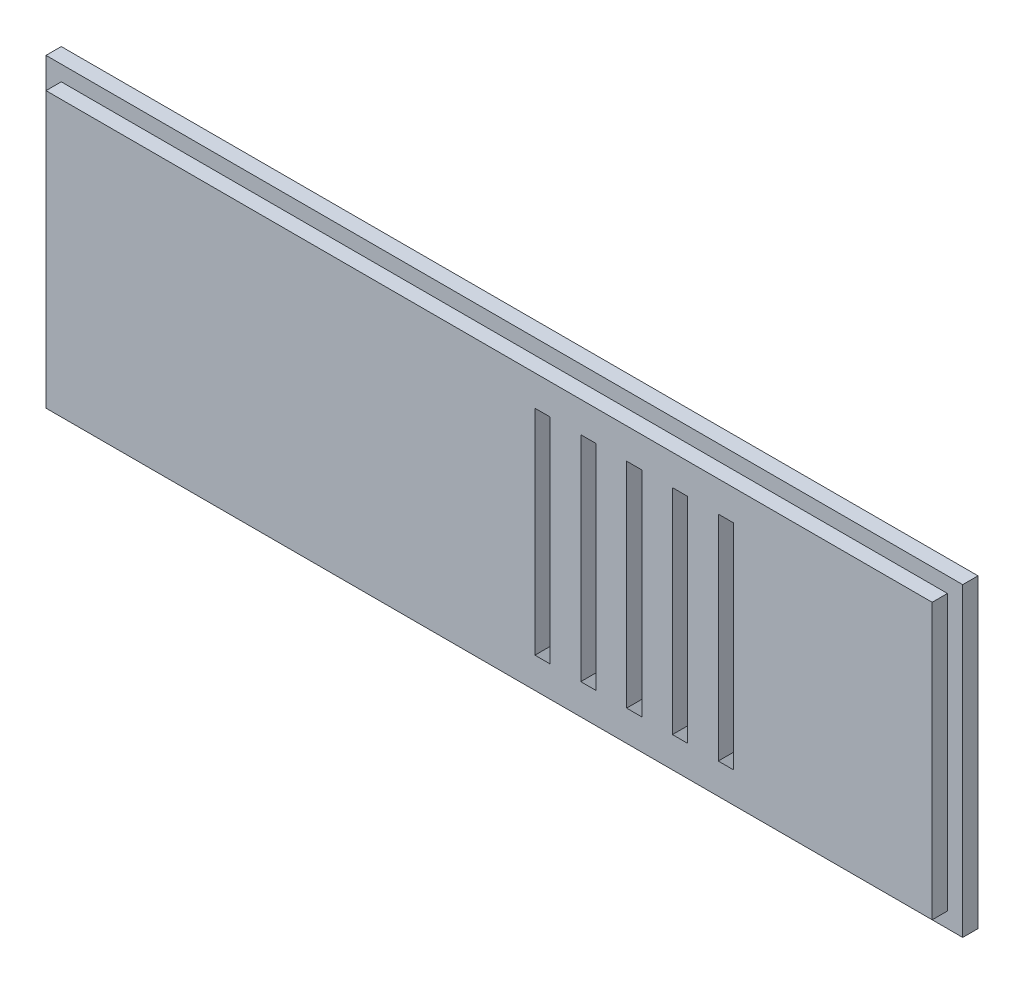
ISO-10303-21;
HEADER;
FILE_DESCRIPTION(('STEP AP214'),'2;1');
FILE_NAME('part.step','',(''),(''),'','','');
FILE_SCHEMA(('AUTOMOTIVE_DESIGN { 1 0 10303 214 1 1 1 1 }'));
ENDSEC;
DATA;
#1=APPLICATION_CONTEXT('core data for automotive mechanical design processes');
#2=APPLICATION_PROTOCOL_DEFINITION('international standard','automotive_design',2000,#1);
#3=PRODUCT_CONTEXT('',#1,'mechanical');
#4=PRODUCT('Part','Part','',(#3));
#5=PRODUCT_RELATED_PRODUCT_CATEGORY('part','',(#4));
#6=PRODUCT_DEFINITION_FORMATION('','',#4);
#7=PRODUCT_DEFINITION_CONTEXT('part definition',#1,'design');
#8=PRODUCT_DEFINITION('design','',#6,#7);
#9=PRODUCT_DEFINITION_SHAPE('','',#8);
#10=(LENGTH_UNIT() NAMED_UNIT(*) SI_UNIT(.MILLI.,.METRE.));
#11=(NAMED_UNIT(*) PLANE_ANGLE_UNIT() SI_UNIT($,.RADIAN.));
#12=(NAMED_UNIT(*) SI_UNIT($,.STERADIAN.) SOLID_ANGLE_UNIT());
#13=UNCERTAINTY_MEASURE_WITH_UNIT(LENGTH_MEASURE(1.E-05),#10,'distance_accuracy_value','');
#14=(GEOMETRIC_REPRESENTATION_CONTEXT(3) GLOBAL_UNCERTAINTY_ASSIGNED_CONTEXT((#13)) GLOBAL_UNIT_ASSIGNED_CONTEXT((#10,
#11,#12)) REPRESENTATION_CONTEXT('',''));
#15=CARTESIAN_POINT('',(0.,0.,0.));
#16=DIRECTION('',(0.,0.,1.));
#17=DIRECTION('',(1.,0.,0.));
#18=AXIS2_PLACEMENT_3D('',#15,#16,#17);
#19=CARTESIAN_POINT('',(0.,0.,1.));
#20=DIRECTION('',(0.,0.,-1.));
#21=DIRECTION('',(-1.,0.,0.));
#22=AXIS2_PLACEMENT_3D('',#19,#20,#21);
#23=PLANE('',#22);
#24=DIRECTION('',(0.,-1.,0.));
#25=VECTOR('',#24,1.);
#26=CARTESIAN_POINT('',(-30.,-10.,1.));
#27=LINE('',#26,#25);
#28=CARTESIAN_POINT('',(-30.,10.,1.));
#29=VERTEX_POINT('',#28);
#30=CARTESIAN_POINT('',(-30.,-10.,1.));
#31=VERTEX_POINT('',#30);
#32=EDGE_CURVE('E455',#29,#31,#27,.T.);
#33=ORIENTED_EDGE('',*,*,#32,.T.);
#34=DIRECTION('',(1.,0.,0.));
#35=VECTOR('',#34,1.);
#36=CARTESIAN_POINT('',(-30.,-10.,1.));
#37=LINE('',#36,#35);
#38=CARTESIAN_POINT('',(30.,-10.,1.));
#39=VERTEX_POINT('',#38);
#40=EDGE_CURVE('E459',#31,#39,#37,.T.);
#41=ORIENTED_EDGE('',*,*,#40,.T.);
#42=DIRECTION('',(0.,1.,0.));
#43=VECTOR('',#42,1.);
#44=CARTESIAN_POINT('',(30.,-10.,1.));
#45=LINE('',#44,#43);
#46=CARTESIAN_POINT('',(30.,10.,1.));
#47=VERTEX_POINT('',#46);
#48=EDGE_CURVE('E463',#39,#47,#45,.T.);
#49=ORIENTED_EDGE('',*,*,#48,.T.);
#50=DIRECTION('',(-1.,0.,0.));
#51=VECTOR('',#50,1.);
#52=CARTESIAN_POINT('',(-30.,10.,1.));
#53=LINE('',#52,#51);
#54=EDGE_CURVE('E466',#47,#29,#53,.T.);
#55=ORIENTED_EDGE('',*,*,#54,.T.);
#56=EDGE_LOOP('',(#33,#41,#49,#55));
#57=FACE_BOUND('',#56,.T.);
#58=DIRECTION('',(-1.,0.,0.));
#59=VECTOR('',#58,1.);
#60=CARTESIAN_POINT('',(29.,9.,1.));
#61=LINE('',#60,#59);
#62=CARTESIAN_POINT('',(29.,9.,1.));
#63=VERTEX_POINT('',#62);
#64=CARTESIAN_POINT('',(-29.,9.,1.));
#65=VERTEX_POINT('',#64);
#66=EDGE_CURVE('E412',#63,#65,#61,.T.);
#67=ORIENTED_EDGE('',*,*,#66,.F.);
#68=DIRECTION('',(0.,1.,0.));
#69=VECTOR('',#68,1.);
#70=CARTESIAN_POINT('',(29.,-9.,1.));
#71=LINE('',#70,#69);
#72=CARTESIAN_POINT('',(29.,-9.,1.));
#73=VERTEX_POINT('',#72);
#74=EDGE_CURVE('E434',#73,#63,#71,.T.);
#75=ORIENTED_EDGE('',*,*,#74,.F.);
#76=DIRECTION('',(1.,0.,0.));
#77=VECTOR('',#76,1.);
#78=CARTESIAN_POINT('',(-29.,-9.,1.));
#79=LINE('',#78,#77);
#80=CARTESIAN_POINT('',(-29.,-9.,1.));
#81=VERTEX_POINT('',#80);
#82=EDGE_CURVE('E425',#81,#73,#79,.T.);
#83=ORIENTED_EDGE('',*,*,#82,.F.);
#84=DIRECTION('',(0.,-1.,0.));
#85=VECTOR('',#84,1.);
#86=CARTESIAN_POINT('',(-29.,9.,1.));
#87=LINE('',#86,#85);
#88=EDGE_CURVE('E418',#65,#81,#87,.T.);
#89=ORIENTED_EDGE('',*,*,#88,.F.);
#90=EDGE_LOOP('',(#67,#75,#83,#89));
#91=FACE_BOUND('',#90,.T.);
#92=ADVANCED_FACE('F41',(#57,#91),#23,.F.);
#93=CARTESIAN_POINT('',(-30.,-10.,1.));
#94=DIRECTION('',(1.,0.,0.));
#95=DIRECTION('',(0.,0.,-1.));
#96=AXIS2_PLACEMENT_3D('',#93,#94,#95);
#97=PLANE('',#96);
#98=DIRECTION('',(0.,-1.,0.));
#99=VECTOR('',#98,1.);
#100=CARTESIAN_POINT('',(-30.,-10.,0.));
#101=LINE('',#100,#99);
#102=CARTESIAN_POINT('',(-30.,10.,0.));
#103=VERTEX_POINT('',#102);
#104=CARTESIAN_POINT('',(-30.,-10.,0.));
#105=VERTEX_POINT('',#104);
#106=EDGE_CURVE('E454',#103,#105,#101,.T.);
#107=ORIENTED_EDGE('',*,*,#106,.T.);
#108=DIRECTION('',(0.,0.,-1.));
#109=VECTOR('',#108,1.);
#110=CARTESIAN_POINT('',(-30.,-10.,1.));
#111=LINE('',#110,#109);
#112=EDGE_CURVE('E222',#31,#105,#111,.T.);
#113=ORIENTED_EDGE('',*,*,#112,.F.);
#114=ORIENTED_EDGE('',*,*,#32,.F.);
#115=DIRECTION('',(0.,0.,-1.));
#116=VECTOR('',#115,1.);
#117=CARTESIAN_POINT('',(-30.,10.,1.));
#118=LINE('',#117,#116);
#119=EDGE_CURVE('E469',#29,#103,#118,.T.);
#120=ORIENTED_EDGE('',*,*,#119,.T.);
#121=EDGE_LOOP('',(#107,#113,#114,#120));
#122=FACE_BOUND('',#121,.T.);
#123=ADVANCED_FACE('F546',(#122),#97,.F.);
#124=CARTESIAN_POINT('',(-30.,-10.,1.));
#125=DIRECTION('',(0.,1.,0.));
#126=DIRECTION('',(0.,0.,1.));
#127=AXIS2_PLACEMENT_3D('',#124,#125,#126);
#128=PLANE('',#127);
#129=DIRECTION('',(1.,0.,0.));
#130=VECTOR('',#129,1.);
#131=CARTESIAN_POINT('',(-30.,-10.,0.));
#132=LINE('',#131,#130);
#133=CARTESIAN_POINT('',(30.,-10.,0.));
#134=VERTEX_POINT('',#133);
#135=EDGE_CURVE('E473',#105,#134,#132,.T.);
#136=ORIENTED_EDGE('',*,*,#135,.T.);
#137=DIRECTION('',(0.,0.,-1.));
#138=VECTOR('',#137,1.);
#139=CARTESIAN_POINT('',(30.,-10.,1.));
#140=LINE('',#139,#138);
#141=EDGE_CURVE('E488',#39,#134,#140,.T.);
#142=ORIENTED_EDGE('',*,*,#141,.F.);
#143=ORIENTED_EDGE('',*,*,#40,.F.);
#144=ORIENTED_EDGE('',*,*,#112,.T.);
#145=EDGE_LOOP('',(#136,#142,#143,#144));
#146=FACE_BOUND('',#145,.T.);
#147=ADVANCED_FACE('F552',(#146),#128,.F.);
#148=CARTESIAN_POINT('',(30.,-10.,1.));
#149=DIRECTION('',(-1.,0.,0.));
#150=DIRECTION('',(0.,0.,1.));
#151=AXIS2_PLACEMENT_3D('',#148,#149,#150);
#152=PLANE('',#151);
#153=DIRECTION('',(0.,1.,0.));
#154=VECTOR('',#153,1.);
#155=CARTESIAN_POINT('',(30.,-10.,0.));
#156=LINE('',#155,#154);
#157=CARTESIAN_POINT('',(30.,10.,0.));
#158=VERTEX_POINT('',#157);
#159=EDGE_CURVE('E476',#134,#158,#156,.T.);
#160=ORIENTED_EDGE('',*,*,#159,.T.);
#161=DIRECTION('',(0.,0.,-1.));
#162=VECTOR('',#161,1.);
#163=CARTESIAN_POINT('',(30.,10.,1.));
#164=LINE('',#163,#162);
#165=EDGE_CURVE('E484',#47,#158,#164,.T.);
#166=ORIENTED_EDGE('',*,*,#165,.F.);
#167=ORIENTED_EDGE('',*,*,#48,.F.);
#168=ORIENTED_EDGE('',*,*,#141,.T.);
#169=EDGE_LOOP('',(#160,#166,#167,#168));
#170=FACE_BOUND('',#169,.T.);
#171=ADVANCED_FACE('F565',(#170),#152,.F.);
#172=CARTESIAN_POINT('',(-30.,10.,1.));
#173=DIRECTION('',(0.,-1.,0.));
#174=DIRECTION('',(0.,0.,-1.));
#175=AXIS2_PLACEMENT_3D('',#172,#173,#174);
#176=PLANE('',#175);
#177=DIRECTION('',(-1.,0.,0.));
#178=VECTOR('',#177,1.);
#179=CARTESIAN_POINT('',(-30.,10.,0.));
#180=LINE('',#179,#178);
#181=EDGE_CURVE('E460',#158,#103,#180,.T.);
#182=ORIENTED_EDGE('',*,*,#181,.T.);
#183=ORIENTED_EDGE('',*,*,#119,.F.);
#184=ORIENTED_EDGE('',*,*,#54,.F.);
#185=ORIENTED_EDGE('',*,*,#165,.T.);
#186=EDGE_LOOP('',(#182,#183,#184,#185));
#187=FACE_BOUND('',#186,.T.);
#188=ADVANCED_FACE('F562',(#187),#176,.F.);
#189=CARTESIAN_POINT('',(0.,0.,0.));
#190=DIRECTION('',(0.,0.,-1.));
#191=DIRECTION('',(-1.,0.,0.));
#192=AXIS2_PLACEMENT_3D('',#189,#190,#191);
#193=PLANE('',#192);
#194=DIRECTION('',(-1.,0.,0.));
#195=VECTOR('',#194,1.);
#196=CARTESIAN_POINT('',(6.,8.,0.));
#197=LINE('',#196,#195);
#198=CARTESIAN_POINT('',(8.00000000000001,7.99999999999999,0.));
#199=VERTEX_POINT('',#198);
#200=CARTESIAN_POINT('',(4.99999999999999,8.,0.));
#201=VERTEX_POINT('',#200);
#202=EDGE_CURVE('E319',#199,#201,#197,.T.);
#203=ORIENTED_EDGE('',*,*,#202,.T.);
#204=DIRECTION('',(-1.,0.,0.));
#205=VECTOR('',#204,1.);
#206=CARTESIAN_POINT('',(3.,8.,0.));
#207=LINE('',#206,#205);
#208=CARTESIAN_POINT('',(1.99999999999999,8.,0.));
#209=VERTEX_POINT('',#208);
#210=EDGE_CURVE('E11',#201,#209,#207,.T.);
#211=ORIENTED_EDGE('',*,*,#210,.T.);
#212=DIRECTION('',(0.,-1.,0.));
#213=VECTOR('',#212,1.);
#214=CARTESIAN_POINT('',(1.99999999999999,-7.,0.));
#215=LINE('',#214,#213);
#216=CARTESIAN_POINT('',(1.99999999999999,-8.,0.));
#217=VERTEX_POINT('',#216);
#218=EDGE_CURVE('E52',#209,#217,#215,.T.);
#219=ORIENTED_EDGE('',*,*,#218,.T.);
#220=DIRECTION('',(1.,0.,0.));
#221=VECTOR('',#220,1.);
#222=CARTESIAN_POINT('',(4.,-8.,0.));
#223=LINE('',#222,#221);
#224=CARTESIAN_POINT('',(4.99999999999999,-8.,0.));
#225=VERTEX_POINT('',#224);
#226=EDGE_CURVE('E322',#217,#225,#223,.T.);
#227=ORIENTED_EDGE('',*,*,#226,.T.);
#228=DIRECTION('',(1.,0.,0.));
#229=VECTOR('',#228,1.);
#230=CARTESIAN_POINT('',(7.,-8.,0.));
#231=LINE('',#230,#229);
#232=CARTESIAN_POINT('',(8.00000000000001,-7.99999999999999,0.));
#233=VERTEX_POINT('',#232);
#234=EDGE_CURVE('E316',#225,#233,#231,.T.);
#235=ORIENTED_EDGE('',*,*,#234,.T.);
#236=DIRECTION('',(1.,0.,0.));
#237=VECTOR('',#236,1.);
#238=CARTESIAN_POINT('',(10.,-7.99999999999999,0.));
#239=LINE('',#238,#237);
#240=CARTESIAN_POINT('',(11.,-8.,0.));
#241=VERTEX_POINT('',#240);
#242=EDGE_CURVE('E313',#233,#241,#239,.T.);
#243=ORIENTED_EDGE('',*,*,#242,.T.);
#244=DIRECTION('',(1.,0.,0.));
#245=VECTOR('',#244,1.);
#246=CARTESIAN_POINT('',(13.,-8.,0.));
#247=LINE('',#246,#245);
#248=CARTESIAN_POINT('',(14.,-8.00000000000001,0.));
#249=VERTEX_POINT('',#248);
#250=EDGE_CURVE('E304',#241,#249,#247,.T.);
#251=ORIENTED_EDGE('',*,*,#250,.T.);
#252=DIRECTION('',(1.,0.,0.));
#253=VECTOR('',#252,1.);
#254=CARTESIAN_POINT('',(16.,-8.00000000000001,0.));
#255=LINE('',#254,#253);
#256=CARTESIAN_POINT('',(17.,-8.00000000000001,0.));
#257=VERTEX_POINT('',#256);
#258=EDGE_CURVE('E301',#249,#257,#255,.T.);
#259=ORIENTED_EDGE('',*,*,#258,.T.);
#260=DIRECTION('',(0.,1.,0.));
#261=VECTOR('',#260,1.);
#262=CARTESIAN_POINT('',(17.,7.,0.));
#263=LINE('',#262,#261);
#264=CARTESIAN_POINT('',(17.,8.00000000000001,0.));
#265=VERTEX_POINT('',#264);
#266=EDGE_CURVE('E295',#257,#265,#263,.T.);
#267=ORIENTED_EDGE('',*,*,#266,.T.);
#268=DIRECTION('',(-1.,0.,0.));
#269=VECTOR('',#268,1.);
#270=CARTESIAN_POINT('',(15.,8.00000000000001,0.));
#271=LINE('',#270,#269);
#272=CARTESIAN_POINT('',(14.,8.00000000000001,0.));
#273=VERTEX_POINT('',#272);
#274=EDGE_CURVE('E298',#265,#273,#271,.T.);
#275=ORIENTED_EDGE('',*,*,#274,.T.);
#276=DIRECTION('',(-1.,0.,0.));
#277=VECTOR('',#276,1.);
#278=CARTESIAN_POINT('',(12.,8.,0.));
#279=LINE('',#278,#277);
#280=CARTESIAN_POINT('',(11.,8.,0.));
#281=VERTEX_POINT('',#280);
#282=EDGE_CURVE('E307',#273,#281,#279,.T.);
#283=ORIENTED_EDGE('',*,*,#282,.T.);
#284=DIRECTION('',(-1.,0.,0.));
#285=VECTOR('',#284,1.);
#286=CARTESIAN_POINT('',(9.,7.99999999999999,0.));
#287=LINE('',#286,#285);
#288=EDGE_CURVE('E310',#281,#199,#287,.T.);
#289=ORIENTED_EDGE('',*,*,#288,.T.);
#290=EDGE_LOOP('',(#203,#211,#219,#227,#235,#243,#251,#259,#267,#275,#283,#289));
#291=FACE_BOUND('',#290,.T.);
#292=ORIENTED_EDGE('',*,*,#106,.F.);
#293=ORIENTED_EDGE('',*,*,#181,.F.);
#294=ORIENTED_EDGE('',*,*,#159,.F.);
#295=ORIENTED_EDGE('',*,*,#135,.F.);
#296=EDGE_LOOP('',(#292,#293,#294,#295));
#297=FACE_BOUND('',#296,.T.);
#298=ADVANCED_FACE('F500',(#291,#297),#193,.T.);
#299=CARTESIAN_POINT('',(29.,9.,2.));
#300=DIRECTION('',(0.,-1.,0.));
#301=DIRECTION('',(0.,0.,-1.));
#302=AXIS2_PLACEMENT_3D('',#299,#300,#301);
#303=PLANE('',#302);
#304=ORIENTED_EDGE('',*,*,#66,.T.);
#305=DIRECTION('',(0.,0.,-1.));
#306=VECTOR('',#305,1.);
#307=CARTESIAN_POINT('',(-29.,9.,2.));
#308=LINE('',#307,#306);
#309=CARTESIAN_POINT('',(-29.,9.,2.));
#310=VERTEX_POINT('',#309);
#311=EDGE_CURVE('E450',#310,#65,#308,.T.);
#312=ORIENTED_EDGE('',*,*,#311,.F.);
#313=DIRECTION('',(-1.,0.,0.));
#314=VECTOR('',#313,1.);
#315=CARTESIAN_POINT('',(29.,9.,2.));
#316=LINE('',#315,#314);
#317=CARTESIAN_POINT('',(29.,9.,2.));
#318=VERTEX_POINT('',#317);
#319=EDGE_CURVE('E438',#318,#310,#316,.T.);
#320=ORIENTED_EDGE('',*,*,#319,.F.);
#321=DIRECTION('',(0.,0.,-1.));
#322=VECTOR('',#321,1.);
#323=CARTESIAN_POINT('',(29.,9.,2.));
#324=LINE('',#323,#322);
#325=EDGE_CURVE('E439',#318,#63,#324,.T.);
#326=ORIENTED_EDGE('',*,*,#325,.T.);
#327=EDGE_LOOP('',(#304,#312,#320,#326));
#328=FACE_BOUND('',#327,.T.);
#329=ADVANCED_FACE('F558',(#328),#303,.F.);
#330=CARTESIAN_POINT('',(-29.,9.,2.));
#331=DIRECTION('',(1.,0.,0.));
#332=DIRECTION('',(0.,0.,-1.));
#333=AXIS2_PLACEMENT_3D('',#330,#331,#332);
#334=PLANE('',#333);
#335=ORIENTED_EDGE('',*,*,#88,.T.);
#336=DIRECTION('',(0.,0.,-1.));
#337=VECTOR('',#336,1.);
#338=CARTESIAN_POINT('',(-29.,-9.,2.));
#339=LINE('',#338,#337);
#340=CARTESIAN_POINT('',(-29.,-9.,2.));
#341=VERTEX_POINT('',#340);
#342=EDGE_CURVE('E446',#341,#81,#339,.T.);
#343=ORIENTED_EDGE('',*,*,#342,.F.);
#344=DIRECTION('',(0.,-1.,0.));
#345=VECTOR('',#344,1.);
#346=CARTESIAN_POINT('',(-29.,9.,2.));
#347=LINE('',#346,#345);
#348=EDGE_CURVE('E876',#310,#341,#347,.T.);
#349=ORIENTED_EDGE('',*,*,#348,.F.);
#350=ORIENTED_EDGE('',*,*,#311,.T.);
#351=EDGE_LOOP('',(#335,#343,#349,#350));
#352=FACE_BOUND('',#351,.T.);
#353=ADVANCED_FACE('F817',(#352),#334,.F.);
#354=CARTESIAN_POINT('',(-29.,-9.,2.));
#355=DIRECTION('',(0.,1.,0.));
#356=DIRECTION('',(0.,0.,1.));
#357=AXIS2_PLACEMENT_3D('',#354,#355,#356);
#358=PLANE('',#357);
#359=ORIENTED_EDGE('',*,*,#82,.T.);
#360=DIRECTION('',(0.,0.,-1.));
#361=VECTOR('',#360,1.);
#362=CARTESIAN_POINT('',(29.,-9.,2.));
#363=LINE('',#362,#361);
#364=CARTESIAN_POINT('',(29.,-9.,2.));
#365=VERTEX_POINT('',#364);
#366=EDGE_CURVE('E442',#365,#73,#363,.T.);
#367=ORIENTED_EDGE('',*,*,#366,.F.);
#368=DIRECTION('',(1.,0.,0.));
#369=VECTOR('',#368,1.);
#370=CARTESIAN_POINT('',(-29.,-9.,2.));
#371=LINE('',#370,#369);
#372=EDGE_CURVE('E873',#341,#365,#371,.T.);
#373=ORIENTED_EDGE('',*,*,#372,.F.);
#374=ORIENTED_EDGE('',*,*,#342,.T.);
#375=EDGE_LOOP('',(#359,#367,#373,#374));
#376=FACE_BOUND('',#375,.T.);
#377=ADVANCED_FACE('F541',(#376),#358,.F.);
#378=CARTESIAN_POINT('',(29.,-9.,2.));
#379=DIRECTION('',(-1.,0.,0.));
#380=DIRECTION('',(0.,0.,1.));
#381=AXIS2_PLACEMENT_3D('',#378,#379,#380);
#382=PLANE('',#381);
#383=ORIENTED_EDGE('',*,*,#74,.T.);
#384=ORIENTED_EDGE('',*,*,#325,.F.);
#385=DIRECTION('',(0.,1.,0.));
#386=VECTOR('',#385,1.);
#387=CARTESIAN_POINT('',(29.,-9.,2.));
#388=LINE('',#387,#386);
#389=EDGE_CURVE('E428',#365,#318,#388,.T.);
#390=ORIENTED_EDGE('',*,*,#389,.F.);
#391=ORIENTED_EDGE('',*,*,#366,.T.);
#392=EDGE_LOOP('',(#383,#384,#390,#391));
#393=FACE_BOUND('',#392,.T.);
#394=ADVANCED_FACE('F532',(#393),#382,.F.);
#395=CARTESIAN_POINT('',(0.,0.,2.));
#396=DIRECTION('',(0.,0.,1.));
#397=DIRECTION('',(1.,0.,0.));
#398=AXIS2_PLACEMENT_3D('',#395,#396,#397);
#399=PLANE('',#398);
#400=DIRECTION('',(0.,-1.,0.));
#401=VECTOR('',#400,1.);
#402=CARTESIAN_POINT('',(15.,0.,2.));
#403=LINE('',#402,#401);
#404=CARTESIAN_POINT('',(15.,7.,2.));
#405=VERTEX_POINT('',#404);
#406=CARTESIAN_POINT('',(15.,-7.,2.));
#407=VERTEX_POINT('',#406);
#408=EDGE_CURVE('E292',#405,#407,#403,.T.);
#409=ORIENTED_EDGE('',*,*,#408,.F.);
#410=DIRECTION('',(-1.,0.,0.));
#411=VECTOR('',#410,1.);
#412=CARTESIAN_POINT('',(0.,7.,2.));
#413=LINE('',#412,#411);
#414=CARTESIAN_POINT('',(16.,7.,2.));
#415=VERTEX_POINT('',#414);
#416=EDGE_CURVE('E280',#415,#405,#413,.T.);
#417=ORIENTED_EDGE('',*,*,#416,.F.);
#418=DIRECTION('',(0.,1.,0.));
#419=VECTOR('',#418,1.);
#420=CARTESIAN_POINT('',(16.,0.,2.));
#421=LINE('',#420,#419);
#422=CARTESIAN_POINT('',(16.,-7.,2.));
#423=VERTEX_POINT('',#422);
#424=EDGE_CURVE('E284',#423,#415,#421,.T.);
#425=ORIENTED_EDGE('',*,*,#424,.F.);
#426=DIRECTION('',(1.,0.,0.));
#427=VECTOR('',#426,1.);
#428=CARTESIAN_POINT('',(0.,-7.,2.));
#429=LINE('',#428,#427);
#430=EDGE_CURVE('E288',#407,#423,#429,.T.);
#431=ORIENTED_EDGE('',*,*,#430,.F.);
#432=EDGE_LOOP('',(#409,#417,#425,#431));
#433=FACE_BOUND('',#432,.T.);
#434=DIRECTION('',(-1.,0.,0.));
#435=VECTOR('',#434,1.);
#436=CARTESIAN_POINT('',(0.,7.,2.));
#437=LINE('',#436,#435);
#438=CARTESIAN_POINT('',(13.,7.,2.));
#439=VERTEX_POINT('',#438);
#440=CARTESIAN_POINT('',(12.,7.,2.));
#441=VERTEX_POINT('',#440);
#442=EDGE_CURVE('E276',#439,#441,#437,.T.);
#443=ORIENTED_EDGE('',*,*,#442,.F.);
#444=DIRECTION('',(0.,1.,0.));
#445=VECTOR('',#444,1.);
#446=CARTESIAN_POINT('',(13.,0.,2.));
#447=LINE('',#446,#445);
#448=CARTESIAN_POINT('',(13.,-7.,2.));
#449=VERTEX_POINT('',#448);
#450=EDGE_CURVE('E264',#449,#439,#447,.T.);
#451=ORIENTED_EDGE('',*,*,#450,.F.);
#452=DIRECTION('',(1.,0.,0.));
#453=VECTOR('',#452,1.);
#454=CARTESIAN_POINT('',(0.,-7.,2.));
#455=LINE('',#454,#453);
#456=CARTESIAN_POINT('',(12.,-7.,2.));
#457=VERTEX_POINT('',#456);
#458=EDGE_CURVE('E268',#457,#449,#455,.T.);
#459=ORIENTED_EDGE('',*,*,#458,.F.);
#460=DIRECTION('',(0.,-1.,0.));
#461=VECTOR('',#460,1.);
#462=CARTESIAN_POINT('',(12.,0.,2.));
#463=LINE('',#462,#461);
#464=EDGE_CURVE('E272',#441,#457,#463,.T.);
#465=ORIENTED_EDGE('',*,*,#464,.F.);
#466=EDGE_LOOP('',(#443,#451,#459,#465));
#467=FACE_BOUND('',#466,.T.);
#468=DIRECTION('',(-1.,0.,0.));
#469=VECTOR('',#468,1.);
#470=CARTESIAN_POINT('',(0.,7.,2.));
#471=LINE('',#470,#469);
#472=CARTESIAN_POINT('',(10.,7.,2.));
#473=VERTEX_POINT('',#472);
#474=CARTESIAN_POINT('',(9.,7.,2.));
#475=VERTEX_POINT('',#474);
#476=EDGE_CURVE('E260',#473,#475,#471,.T.);
#477=ORIENTED_EDGE('',*,*,#476,.F.);
#478=DIRECTION('',(0.,1.,0.));
#479=VECTOR('',#478,1.);
#480=CARTESIAN_POINT('',(10.,0.,2.));
#481=LINE('',#480,#479);
#482=CARTESIAN_POINT('',(10.,-7.,2.));
#483=VERTEX_POINT('',#482);
#484=EDGE_CURVE('E249',#483,#473,#481,.T.);
#485=ORIENTED_EDGE('',*,*,#484,.F.);
#486=DIRECTION('',(1.,0.,0.));
#487=VECTOR('',#486,1.);
#488=CARTESIAN_POINT('',(0.,-7.,2.));
#489=LINE('',#488,#487);
#490=CARTESIAN_POINT('',(9.,-7.,2.));
#491=VERTEX_POINT('',#490);
#492=EDGE_CURVE('E253',#491,#483,#489,.T.);
#493=ORIENTED_EDGE('',*,*,#492,.F.);
#494=DIRECTION('',(0.,-1.,0.));
#495=VECTOR('',#494,1.);
#496=CARTESIAN_POINT('',(9.,0.,2.));
#497=LINE('',#496,#495);
#498=EDGE_CURVE('E257',#475,#491,#497,.T.);
#499=ORIENTED_EDGE('',*,*,#498,.F.);
#500=EDGE_LOOP('',(#477,#485,#493,#499));
#501=FACE_BOUND('',#500,.T.);
#502=DIRECTION('',(-1.,0.,0.));
#503=VECTOR('',#502,1.);
#504=CARTESIAN_POINT('',(0.,7.,2.));
#505=LINE('',#504,#503);
#506=CARTESIAN_POINT('',(7.,7.,2.));
#507=VERTEX_POINT('',#506);
#508=CARTESIAN_POINT('',(6.,7.,2.));
#509=VERTEX_POINT('',#508);
#510=EDGE_CURVE('E245',#507,#509,#505,.T.);
#511=ORIENTED_EDGE('',*,*,#510,.F.);
#512=DIRECTION('',(0.,1.,0.));
#513=VECTOR('',#512,1.);
#514=CARTESIAN_POINT('',(7.,0.,2.));
#515=LINE('',#514,#513);
#516=CARTESIAN_POINT('',(7.,-7.,2.));
#517=VERTEX_POINT('',#516);
#518=EDGE_CURVE('E229',#517,#507,#515,.T.);
#519=ORIENTED_EDGE('',*,*,#518,.F.);
#520=DIRECTION('',(1.,0.,0.));
#521=VECTOR('',#520,1.);
#522=CARTESIAN_POINT('',(0.,-7.,2.));
#523=LINE('',#522,#521);
#524=CARTESIAN_POINT('',(6.,-7.,2.));
#525=VERTEX_POINT('',#524);
#526=EDGE_CURVE('E234',#525,#517,#523,.T.);
#527=ORIENTED_EDGE('',*,*,#526,.F.);
#528=DIRECTION('',(0.,-1.,0.));
#529=VECTOR('',#528,1.);
#530=CARTESIAN_POINT('',(6.,0.,2.));
#531=LINE('',#530,#529);
#532=EDGE_CURVE('E241',#509,#525,#531,.T.);
#533=ORIENTED_EDGE('',*,*,#532,.F.);
#534=EDGE_LOOP('',(#511,#519,#527,#533));
#535=FACE_BOUND('',#534,.T.);
#536=DIRECTION('',(-1.,0.,0.));
#537=VECTOR('',#536,1.);
#538=CARTESIAN_POINT('',(0.,7.,2.));
#539=LINE('',#538,#537);
#540=CARTESIAN_POINT('',(4.,7.,2.));
#541=VERTEX_POINT('',#540);
#542=CARTESIAN_POINT('',(3.,7.,2.));
#543=VERTEX_POINT('',#542);
#544=EDGE_CURVE('E208',#541,#543,#539,.T.);
#545=ORIENTED_EDGE('',*,*,#544,.F.);
#546=DIRECTION('',(0.,1.,0.));
#547=VECTOR('',#546,1.);
#548=CARTESIAN_POINT('',(4.,0.,2.));
#549=LINE('',#548,#547);
#550=CARTESIAN_POINT('',(4.,-7.,2.));
#551=VERTEX_POINT('',#550);
#552=EDGE_CURVE('E214',#551,#541,#549,.T.);
#553=ORIENTED_EDGE('',*,*,#552,.F.);
#554=DIRECTION('',(1.,0.,0.));
#555=VECTOR('',#554,1.);
#556=CARTESIAN_POINT('',(0.,-7.,2.));
#557=LINE('',#556,#555);
#558=CARTESIAN_POINT('',(3.,-7.,2.));
#559=VERTEX_POINT('',#558);
#560=EDGE_CURVE('E221',#559,#551,#557,.T.);
#561=ORIENTED_EDGE('',*,*,#560,.F.);
#562=DIRECTION('',(0.,-1.,0.));
#563=VECTOR('',#562,1.);
#564=CARTESIAN_POINT('',(3.,0.,2.));
#565=LINE('',#564,#563);
#566=EDGE_CURVE('E227',#543,#559,#565,.T.);
#567=ORIENTED_EDGE('',*,*,#566,.F.);
#568=EDGE_LOOP('',(#545,#553,#561,#567));
#569=FACE_BOUND('',#568,.T.);
#570=ORIENTED_EDGE('',*,*,#319,.T.);
#571=ORIENTED_EDGE('',*,*,#348,.T.);
#572=ORIENTED_EDGE('',*,*,#372,.T.);
#573=ORIENTED_EDGE('',*,*,#389,.T.);
#574=EDGE_LOOP('',(#570,#571,#572,#573));
#575=FACE_BOUND('',#574,.T.);
#576=ADVANCED_FACE('F224',(#433,#467,#501,#535,#569,#575),#399,.T.);
#577=CARTESIAN_POINT('',(16.,-7.,2.00000000000002));
#578=DIRECTION('',(-0.894427190999916,0.,-0.447213595499959));
#579=DIRECTION('',(0.,1.,0.));
#580=AXIS2_PLACEMENT_3D('',#577,#578,#579);
#581=PLANE('',#580);
#582=DIRECTION('',(0.408248290463864,0.408248290463863,-0.816496580927726));
#583=VECTOR('',#582,1.);
#584=CARTESIAN_POINT('',(16.,7.,2.00000000000002));
#585=LINE('',#584,#583);
#586=EDGE_CURVE('E404',#265,#415,#585,.F.);
#587=ORIENTED_EDGE('',*,*,#586,.F.);
#588=ORIENTED_EDGE('',*,*,#266,.F.);
#589=DIRECTION('',(-0.408248290463864,0.408248290463863,0.816496580927726));
#590=VECTOR('',#589,1.);
#591=CARTESIAN_POINT('',(15.8333333333333,-6.83333333333333,2.33333333333335));
#592=LINE('',#591,#590);
#593=EDGE_CURVE('E46',#423,#257,#592,.F.);
#594=ORIENTED_EDGE('',*,*,#593,.F.);
#595=ORIENTED_EDGE('',*,*,#424,.T.);
#596=EDGE_LOOP('',(#587,#588,#594,#595));
#597=FACE_BOUND('',#596,.T.);
#598=ADVANCED_FACE('F44',(#597),#581,.T.);
#599=CARTESIAN_POINT('',(15.,-7.,2.00000000000002));
#600=DIRECTION('',(0.,0.894427190999916,-0.447213595499958));
#601=DIRECTION('',(1.,0.,0.));
#602=AXIS2_PLACEMENT_3D('',#599,#600,#601);
#603=PLANE('',#602);
#604=ORIENTED_EDGE('',*,*,#593,.T.);
#605=ORIENTED_EDGE('',*,*,#258,.F.);
#606=DIRECTION('',(-0.408248290463863,-0.408248290463863,-0.816496580927726));
#607=VECTOR('',#606,1.);
#608=CARTESIAN_POINT('',(15.,-7.,2.00000000000002));
#609=LINE('',#608,#607);
#610=EDGE_CURVE('E401',#407,#249,#609,.T.);
#611=ORIENTED_EDGE('',*,*,#610,.F.);
#612=ORIENTED_EDGE('',*,*,#430,.T.);
#613=EDGE_LOOP('',(#604,#605,#611,#612));
#614=FACE_BOUND('',#613,.T.);
#615=ADVANCED_FACE('F539',(#614),#603,.T.);
#616=CARTESIAN_POINT('',(16.,7.,2.00000000000002));
#617=DIRECTION('',(0.,-0.894427190999916,-0.447213595499958));
#618=DIRECTION('',(-1.,0.,0.));
#619=AXIS2_PLACEMENT_3D('',#616,#617,#618);
#620=PLANE('',#619);
#621=ORIENTED_EDGE('',*,*,#586,.T.);
#622=ORIENTED_EDGE('',*,*,#416,.T.);
#623=DIRECTION('',(-0.408248290463863,0.408248290463863,-0.816496580927726));
#624=VECTOR('',#623,1.);
#625=CARTESIAN_POINT('',(15.,7.,2.00000000000002));
#626=LINE('',#625,#624);
#627=EDGE_CURVE('E397',#273,#405,#626,.F.);
#628=ORIENTED_EDGE('',*,*,#627,.F.);
#629=ORIENTED_EDGE('',*,*,#274,.F.);
#630=EDGE_LOOP('',(#621,#622,#628,#629));
#631=FACE_BOUND('',#630,.T.);
#632=ADVANCED_FACE('F672',(#631),#620,.T.);
#633=CARTESIAN_POINT('',(15.,7.,2.00000000000002));
#634=DIRECTION('',(0.894427190999916,0.,-0.447213595499958));
#635=DIRECTION('',(0.,-1.,0.));
#636=AXIS2_PLACEMENT_3D('',#633,#634,#635);
#637=PLANE('',#636);
#638=DIRECTION('',(0.,-1.,0.));
#639=VECTOR('',#638,1.);
#640=CARTESIAN_POINT('',(14.,-7.,0.));
#641=LINE('',#640,#639);
#642=EDGE_CURVE('E393',#273,#249,#641,.T.);
#643=ORIENTED_EDGE('',*,*,#642,.F.);
#644=ORIENTED_EDGE('',*,*,#627,.T.);
#645=ORIENTED_EDGE('',*,*,#408,.T.);
#646=ORIENTED_EDGE('',*,*,#610,.T.);
#647=EDGE_LOOP('',(#643,#644,#645,#646));
#648=FACE_BOUND('',#647,.T.);
#649=ADVANCED_FACE('F665',(#648),#637,.T.);
#650=CARTESIAN_POINT('',(13.,-7.,2.00000000000001));
#651=DIRECTION('',(-0.894427190999917,0.,-0.447213595499955));
#652=DIRECTION('',(0.,1.,0.));
#653=AXIS2_PLACEMENT_3D('',#650,#651,#652);
#654=PLANE('',#653);
#655=DIRECTION('',(0.408248290463861,0.408248290463861,-0.816496580927728));
#656=VECTOR('',#655,1.);
#657=CARTESIAN_POINT('',(13.,7.,2.00000000000001));
#658=LINE('',#657,#656);
#659=EDGE_CURVE('E386',#273,#439,#658,.F.);
#660=ORIENTED_EDGE('',*,*,#659,.F.);
#661=ORIENTED_EDGE('',*,*,#642,.T.);
#662=DIRECTION('',(-0.408248290463861,0.408248290463861,0.816496580927728));
#663=VECTOR('',#662,1.);
#664=CARTESIAN_POINT('',(12.8333333333333,-6.83333333333334,2.33333333333334));
#665=LINE('',#664,#663);
#666=EDGE_CURVE('E389',#449,#249,#665,.F.);
#667=ORIENTED_EDGE('',*,*,#666,.F.);
#668=ORIENTED_EDGE('',*,*,#450,.T.);
#669=EDGE_LOOP('',(#660,#661,#667,#668));
#670=FACE_BOUND('',#669,.T.);
#671=ADVANCED_FACE('F658',(#670),#654,.T.);
#672=CARTESIAN_POINT('',(12.,-7.,2.00000000000001));
#673=DIRECTION('',(0.,0.894427190999917,-0.447213595499955));
#674=DIRECTION('',(1.,0.,0.));
#675=AXIS2_PLACEMENT_3D('',#672,#673,#674);
#676=PLANE('',#675);
#677=ORIENTED_EDGE('',*,*,#666,.T.);
#678=ORIENTED_EDGE('',*,*,#250,.F.);
#679=DIRECTION('',(0.408248290463861,0.408248290463861,0.816496580927728));
#680=VECTOR('',#679,1.);
#681=CARTESIAN_POINT('',(14.3333333333333,-4.66666666666669,6.66666666666666));
#682=LINE('',#681,#680);
#683=EDGE_CURVE('E382',#457,#241,#682,.F.);
#684=ORIENTED_EDGE('',*,*,#683,.F.);
#685=ORIENTED_EDGE('',*,*,#458,.T.);
#686=EDGE_LOOP('',(#677,#678,#684,#685));
#687=FACE_BOUND('',#686,.T.);
#688=ADVANCED_FACE('F651',(#687),#676,.T.);
#689=CARTESIAN_POINT('',(13.,7.,2.00000000000001));
#690=DIRECTION('',(0.,-0.894427190999917,-0.447213595499955));
#691=DIRECTION('',(-1.,0.,0.));
#692=AXIS2_PLACEMENT_3D('',#689,#690,#691);
#693=PLANE('',#692);
#694=ORIENTED_EDGE('',*,*,#659,.T.);
#695=ORIENTED_EDGE('',*,*,#442,.T.);
#696=DIRECTION('',(0.408248290463861,-0.408248290463861,0.816496580927728));
#697=VECTOR('',#696,1.);
#698=CARTESIAN_POINT('',(12.1666666666667,6.83333333333333,2.33333333333334));
#699=LINE('',#698,#697);
#700=EDGE_CURVE('E378',#281,#441,#699,.T.);
#701=ORIENTED_EDGE('',*,*,#700,.F.);
#702=ORIENTED_EDGE('',*,*,#282,.F.);
#703=EDGE_LOOP('',(#694,#695,#701,#702));
#704=FACE_BOUND('',#703,.T.);
#705=ADVANCED_FACE('F644',(#704),#693,.T.);
#706=CARTESIAN_POINT('',(12.,7.,2.00000000000001));
#707=DIRECTION('',(0.894427190999917,0.,-0.447213595499955));
#708=DIRECTION('',(0.,-1.,0.));
#709=AXIS2_PLACEMENT_3D('',#706,#707,#708);
#710=PLANE('',#709);
#711=DIRECTION('',(0.,-1.,0.));
#712=VECTOR('',#711,1.);
#713=CARTESIAN_POINT('',(11.,-7.,0.));
#714=LINE('',#713,#712);
#715=EDGE_CURVE('E374',#281,#241,#714,.T.);
#716=ORIENTED_EDGE('',*,*,#715,.F.);
#717=ORIENTED_EDGE('',*,*,#700,.T.);
#718=ORIENTED_EDGE('',*,*,#464,.T.);
#719=ORIENTED_EDGE('',*,*,#683,.T.);
#720=EDGE_LOOP('',(#716,#717,#718,#719));
#721=FACE_BOUND('',#720,.T.);
#722=ADVANCED_FACE('F637',(#721),#710,.T.);
#723=CARTESIAN_POINT('',(10.,-7.,1.99999999999999));
#724=DIRECTION('',(-0.894427190999916,0.,-0.447213595499957));
#725=DIRECTION('',(0.,1.,0.));
#726=AXIS2_PLACEMENT_3D('',#723,#724,#725);
#727=PLANE('',#726);
#728=DIRECTION('',(0.408248290463862,0.408248290463862,-0.816496580927727));
#729=VECTOR('',#728,1.);
#730=CARTESIAN_POINT('',(10.,7.,1.99999999999999));
#731=LINE('',#730,#729);
#732=EDGE_CURVE('E366',#281,#473,#731,.F.);
#733=ORIENTED_EDGE('',*,*,#732,.F.);
#734=ORIENTED_EDGE('',*,*,#715,.T.);
#735=DIRECTION('',(-0.408248290463862,0.408248290463862,0.816496580927727));
#736=VECTOR('',#735,1.);
#737=CARTESIAN_POINT('',(9.83333333333333,-6.83333333333333,2.33333333333333));
#738=LINE('',#737,#736);
#739=EDGE_CURVE('E370',#483,#241,#738,.F.);
#740=ORIENTED_EDGE('',*,*,#739,.F.);
#741=ORIENTED_EDGE('',*,*,#484,.T.);
#742=EDGE_LOOP('',(#733,#734,#740,#741));
#743=FACE_BOUND('',#742,.T.);
#744=ADVANCED_FACE('F631',(#743),#727,.T.);
#745=CARTESIAN_POINT('',(9.,-7.,1.99999999999999));
#746=DIRECTION('',(0.,0.894427190999917,-0.447213595499956));
#747=DIRECTION('',(1.,0.,0.));
#748=AXIS2_PLACEMENT_3D('',#745,#746,#747);
#749=PLANE('',#748);
#750=ORIENTED_EDGE('',*,*,#739,.T.);
#751=ORIENTED_EDGE('',*,*,#242,.F.);
#752=DIRECTION('',(-0.408248290463862,-0.408248290463862,-0.816496580927727));
#753=VECTOR('',#752,1.);
#754=CARTESIAN_POINT('',(9.,-7.,1.99999999999999));
#755=LINE('',#754,#753);
#756=EDGE_CURVE('E362',#491,#233,#755,.T.);
#757=ORIENTED_EDGE('',*,*,#756,.F.);
#758=ORIENTED_EDGE('',*,*,#492,.T.);
#759=EDGE_LOOP('',(#750,#751,#757,#758));
#760=FACE_BOUND('',#759,.T.);
#761=ADVANCED_FACE('F520',(#760),#749,.T.);
#762=CARTESIAN_POINT('',(10.,7.,1.99999999999999));
#763=DIRECTION('',(0.,-0.894427190999917,-0.447213595499956));
#764=DIRECTION('',(-1.,0.,0.));
#765=AXIS2_PLACEMENT_3D('',#762,#763,#764);
#766=PLANE('',#765);
#767=ORIENTED_EDGE('',*,*,#732,.T.);
#768=ORIENTED_EDGE('',*,*,#476,.T.);
#769=DIRECTION('',(-0.408248290463862,0.408248290463862,-0.816496580927727));
#770=VECTOR('',#769,1.);
#771=CARTESIAN_POINT('',(9.,7.,1.99999999999999));
#772=LINE('',#771,#770);
#773=EDGE_CURVE('E358',#199,#475,#772,.F.);
#774=ORIENTED_EDGE('',*,*,#773,.F.);
#775=ORIENTED_EDGE('',*,*,#288,.F.);
#776=EDGE_LOOP('',(#767,#768,#774,#775));
#777=FACE_BOUND('',#776,.T.);
#778=ADVANCED_FACE('F619',(#777),#766,.T.);
#779=CARTESIAN_POINT('',(9.,7.,1.99999999999999));
#780=DIRECTION('',(0.894427190999916,0.,-0.447213595499957));
#781=DIRECTION('',(0.,-1.,0.));
#782=AXIS2_PLACEMENT_3D('',#779,#780,#781);
#783=PLANE('',#782);
#784=DIRECTION('',(0.,-1.,0.));
#785=VECTOR('',#784,1.);
#786=CARTESIAN_POINT('',(8.00000000000001,-7.,0.));
#787=LINE('',#786,#785);
#788=EDGE_CURVE('E354',#199,#233,#787,.T.);
#789=ORIENTED_EDGE('',*,*,#788,.F.);
#790=ORIENTED_EDGE('',*,*,#773,.T.);
#791=ORIENTED_EDGE('',*,*,#498,.T.);
#792=ORIENTED_EDGE('',*,*,#756,.T.);
#793=EDGE_LOOP('',(#789,#790,#791,#792));
#794=FACE_BOUND('',#793,.T.);
#795=ADVANCED_FACE('F525',(#794),#783,.T.);
#796=CARTESIAN_POINT('',(7.,-7.,2.00000000000002));
#797=DIRECTION('',(-0.894427190999917,0.,-0.447213595499957));
#798=DIRECTION('',(0.,1.,0.));
#799=AXIS2_PLACEMENT_3D('',#796,#797,#798);
#800=PLANE('',#799);
#801=DIRECTION('',(-0.408248290463862,-0.408248290463862,0.816496580927727));
#802=VECTOR('',#801,1.);
#803=CARTESIAN_POINT('',(4.66666666666668,4.66666666666668,6.66666666666667));
#804=LINE('',#803,#802);
#805=EDGE_CURVE('E346',#199,#507,#804,.T.);
#806=ORIENTED_EDGE('',*,*,#805,.F.);
#807=ORIENTED_EDGE('',*,*,#788,.T.);
#808=DIRECTION('',(0.408248290463862,-0.408248290463862,-0.816496580927727));
#809=VECTOR('',#808,1.);
#810=CARTESIAN_POINT('',(7.,-7.,2.00000000000002));
#811=LINE('',#810,#809);
#812=EDGE_CURVE('E350',#517,#233,#811,.T.);
#813=ORIENTED_EDGE('',*,*,#812,.F.);
#814=ORIENTED_EDGE('',*,*,#518,.T.);
#815=EDGE_LOOP('',(#806,#807,#813,#814));
#816=FACE_BOUND('',#815,.T.);
#817=ADVANCED_FACE('F528',(#816),#800,.T.);
#818=CARTESIAN_POINT('',(6.,-7.,2.00000000000002));
#819=DIRECTION('',(0.,0.894427190999917,-0.447213595499956));
#820=DIRECTION('',(1.,0.,0.));
#821=AXIS2_PLACEMENT_3D('',#818,#819,#820);
#822=PLANE('',#821);
#823=ORIENTED_EDGE('',*,*,#812,.T.);
#824=ORIENTED_EDGE('',*,*,#234,.F.);
#825=DIRECTION('',(0.408248290463862,0.408248290463862,0.816496580927727));
#826=VECTOR('',#825,1.);
#827=CARTESIAN_POINT('',(8.33333333333332,-4.66666666666668,6.66666666666667));
#828=LINE('',#827,#826);
#829=EDGE_CURVE('E342',#525,#225,#828,.F.);
#830=ORIENTED_EDGE('',*,*,#829,.F.);
#831=ORIENTED_EDGE('',*,*,#526,.T.);
#832=EDGE_LOOP('',(#823,#824,#830,#831));
#833=FACE_BOUND('',#832,.T.);
#834=ADVANCED_FACE('F514',(#833),#822,.T.);
#835=CARTESIAN_POINT('',(7.,7.,2.00000000000002));
#836=DIRECTION('',(0.,-0.894427190999917,-0.447213595499956));
#837=DIRECTION('',(-1.,0.,0.));
#838=AXIS2_PLACEMENT_3D('',#835,#836,#837);
#839=PLANE('',#838);
#840=ORIENTED_EDGE('',*,*,#805,.T.);
#841=ORIENTED_EDGE('',*,*,#510,.T.);
#842=DIRECTION('',(0.408248290463862,-0.408248290463862,0.816496580927727));
#843=VECTOR('',#842,1.);
#844=CARTESIAN_POINT('',(6.16666666666667,6.83333333333333,2.33333333333335));
#845=LINE('',#844,#843);
#846=EDGE_CURVE('E338',#201,#509,#845,.T.);
#847=ORIENTED_EDGE('',*,*,#846,.F.);
#848=ORIENTED_EDGE('',*,*,#202,.F.);
#849=EDGE_LOOP('',(#840,#841,#847,#848));
#850=FACE_BOUND('',#849,.T.);
#851=ADVANCED_FACE('F508',(#850),#839,.T.);
#852=CARTESIAN_POINT('',(3.,-7.,2.00000000000002));
#853=DIRECTION('',(0.,0.894427190999917,-0.447213595499956));
#854=DIRECTION('',(1.,0.,0.));
#855=AXIS2_PLACEMENT_3D('',#852,#853,#854);
#856=PLANE('',#855);
#857=DIRECTION('',(0.408248290463862,-0.408248290463862,-0.816496580927727));
#858=VECTOR('',#857,1.);
#859=CARTESIAN_POINT('',(4.,-7.,2.00000000000002));
#860=LINE('',#859,#858);
#861=EDGE_CURVE('E217',#225,#551,#860,.F.);
#862=ORIENTED_EDGE('',*,*,#861,.F.);
#863=ORIENTED_EDGE('',*,*,#226,.F.);
#864=DIRECTION('',(0.408248290463862,0.408248290463862,0.816496580927727));
#865=VECTOR('',#864,1.);
#866=CARTESIAN_POINT('',(5.33333333333332,-4.66666666666668,6.66666666666667));
#867=LINE('',#866,#865);
#868=EDGE_CURVE('E334',#559,#217,#867,.F.);
#869=ORIENTED_EDGE('',*,*,#868,.F.);
#870=ORIENTED_EDGE('',*,*,#560,.T.);
#871=EDGE_LOOP('',(#862,#863,#869,#870));
#872=FACE_BOUND('',#871,.T.);
#873=ADVANCED_FACE('F497',(#872),#856,.T.);
#874=CARTESIAN_POINT('',(6.,7.,2.00000000000002));
#875=DIRECTION('',(0.894427190999917,0.,-0.447213595499957));
#876=DIRECTION('',(0.,-1.,0.));
#877=AXIS2_PLACEMENT_3D('',#874,#875,#876);
#878=PLANE('',#877);
#879=ORIENTED_EDGE('',*,*,#532,.T.);
#880=ORIENTED_EDGE('',*,*,#829,.T.);
#881=DIRECTION('',(0.,-1.,0.));
#882=VECTOR('',#881,1.);
#883=CARTESIAN_POINT('',(4.99999999999999,-7.,0.));
#884=LINE('',#883,#882);
#885=EDGE_CURVE('E329',#201,#225,#884,.T.);
#886=ORIENTED_EDGE('',*,*,#885,.F.);
#887=ORIENTED_EDGE('',*,*,#846,.T.);
#888=EDGE_LOOP('',(#879,#880,#886,#887));
#889=FACE_BOUND('',#888,.T.);
#890=ADVANCED_FACE('F510',(#889),#878,.T.);
#891=CARTESIAN_POINT('',(3.,7.,2.00000000000002));
#892=DIRECTION('',(0.894427190999917,0.,-0.447213595499957));
#893=DIRECTION('',(0.,-1.,0.));
#894=AXIS2_PLACEMENT_3D('',#891,#892,#893);
#895=PLANE('',#894);
#896=ORIENTED_EDGE('',*,*,#868,.T.);
#897=ORIENTED_EDGE('',*,*,#218,.F.);
#898=DIRECTION('',(0.408248290463862,-0.408248290463862,0.816496580927727));
#899=VECTOR('',#898,1.);
#900=CARTESIAN_POINT('',(3.16666666666667,6.83333333333333,2.33333333333335));
#901=LINE('',#900,#899);
#902=EDGE_CURVE('E60',#543,#209,#901,.F.);
#903=ORIENTED_EDGE('',*,*,#902,.F.);
#904=ORIENTED_EDGE('',*,*,#566,.T.);
#905=EDGE_LOOP('',(#896,#897,#903,#904));
#906=FACE_BOUND('',#905,.T.);
#907=ADVANCED_FACE('F499',(#906),#895,.T.);
#908=CARTESIAN_POINT('',(4.,-7.,2.00000000000002));
#909=DIRECTION('',(-0.894427190999917,0.,-0.447213595499957));
#910=DIRECTION('',(0.,1.,0.));
#911=AXIS2_PLACEMENT_3D('',#908,#909,#910);
#912=PLANE('',#911);
#913=ORIENTED_EDGE('',*,*,#861,.T.);
#914=ORIENTED_EDGE('',*,*,#552,.T.);
#915=DIRECTION('',(0.408248290463862,0.408248290463862,-0.816496580927727));
#916=VECTOR('',#915,1.);
#917=CARTESIAN_POINT('',(4.,7.,2.00000000000002));
#918=LINE('',#917,#916);
#919=EDGE_CURVE('E204',#201,#541,#918,.F.);
#920=ORIENTED_EDGE('',*,*,#919,.F.);
#921=ORIENTED_EDGE('',*,*,#885,.T.);
#922=EDGE_LOOP('',(#913,#914,#920,#921));
#923=FACE_BOUND('',#922,.T.);
#924=ADVANCED_FACE('F215',(#923),#912,.T.);
#925=CARTESIAN_POINT('',(4.,7.,2.00000000000002));
#926=DIRECTION('',(0.,-0.894427190999917,-0.447213595499956));
#927=DIRECTION('',(-1.,0.,0.));
#928=AXIS2_PLACEMENT_3D('',#925,#926,#927);
#929=PLANE('',#928);
#930=ORIENTED_EDGE('',*,*,#902,.T.);
#931=ORIENTED_EDGE('',*,*,#210,.F.);
#932=ORIENTED_EDGE('',*,*,#919,.T.);
#933=ORIENTED_EDGE('',*,*,#544,.T.);
#934=EDGE_LOOP('',(#930,#931,#932,#933));
#935=FACE_BOUND('',#934,.T.);
#936=ADVANCED_FACE('F206',(#935),#929,.T.);
#937=CLOSED_SHELL('',(#92,#123,#147,#171,#188,#298,#329,#353,#377,#394,#576,#598,#615,#632,#649,
#671,#688,#705,#722,#744,#761,#778,#795,#817,#834,#851,#873,#890,#907,#924,#936));
#938=MANIFOLD_SOLID_BREP('B2',#937);
#939=ADVANCED_BREP_SHAPE_REPRESENTATION('',(#18,#938),#14);
#940=SHAPE_DEFINITION_REPRESENTATION(#9,#939);
ENDSEC;
END-ISO-10303-21;
